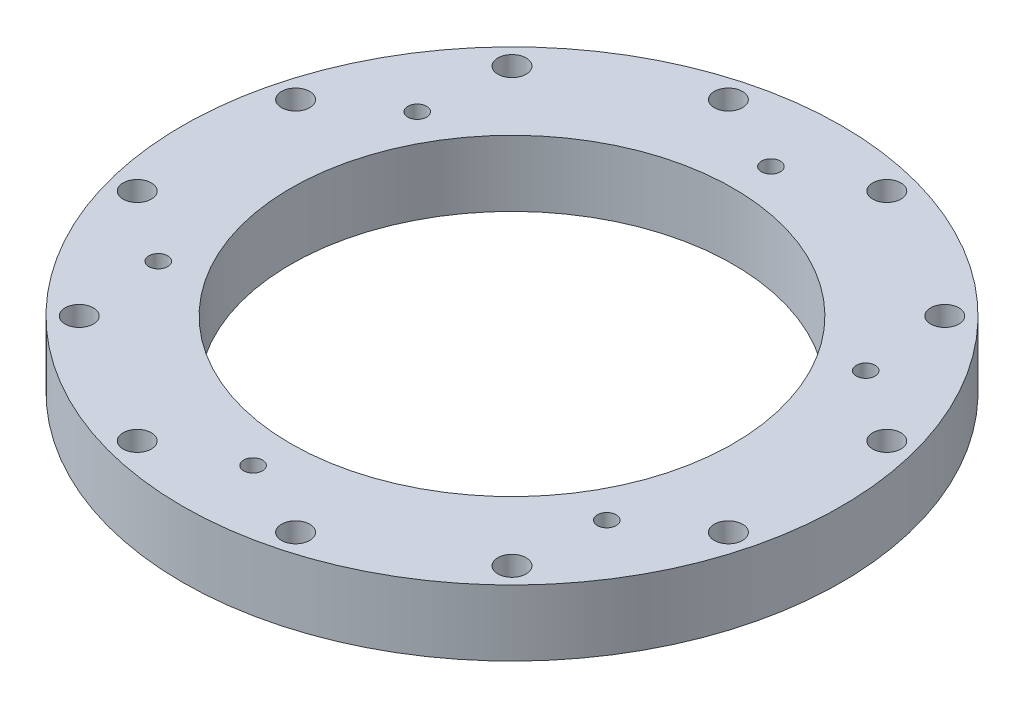
ISO-10303-21;
HEADER;
FILE_DESCRIPTION(('STEP AP214'),'2;1');
FILE_NAME('part.step','',(''),(''),'','','');
FILE_SCHEMA(('AUTOMOTIVE_DESIGN { 1 0 10303 214 1 1 1 1 }'));
ENDSEC;
DATA;
#1=APPLICATION_CONTEXT('core data for automotive mechanical design processes');
#2=APPLICATION_PROTOCOL_DEFINITION('international standard','automotive_design',2000,#1);
#3=PRODUCT_CONTEXT('',#1,'mechanical');
#4=PRODUCT('Part','Part','',(#3));
#5=PRODUCT_RELATED_PRODUCT_CATEGORY('part','',(#4));
#6=PRODUCT_DEFINITION_FORMATION('','',#4);
#7=PRODUCT_DEFINITION_CONTEXT('part definition',#1,'design');
#8=PRODUCT_DEFINITION('design','',#6,#7);
#9=PRODUCT_DEFINITION_SHAPE('','',#8);
#10=(LENGTH_UNIT() NAMED_UNIT(*) SI_UNIT(.MILLI.,.METRE.));
#11=(NAMED_UNIT(*) PLANE_ANGLE_UNIT() SI_UNIT($,.RADIAN.));
#12=(NAMED_UNIT(*) SI_UNIT($,.STERADIAN.) SOLID_ANGLE_UNIT());
#13=UNCERTAINTY_MEASURE_WITH_UNIT(LENGTH_MEASURE(1.E-05),#10,'distance_accuracy_value','');
#14=(GEOMETRIC_REPRESENTATION_CONTEXT(3) GLOBAL_UNCERTAINTY_ASSIGNED_CONTEXT((#13)) GLOBAL_UNIT_ASSIGNED_CONTEXT((#10,
#11,#12)) REPRESENTATION_CONTEXT('',''));
#15=CARTESIAN_POINT('',(0.,0.,0.));
#16=DIRECTION('',(0.,0.,1.));
#17=DIRECTION('',(1.,0.,0.));
#18=AXIS2_PLACEMENT_3D('',#15,#16,#17);
#19=CARTESIAN_POINT('',(0.,7.,0.));
#20=DIRECTION('',(0.,1.,0.));
#21=DIRECTION('',(0.,0.,1.));
#22=AXIS2_PLACEMENT_3D('',#19,#20,#21);
#23=PLANE('',#22);
#24=CARTESIAN_POINT('',(-8.4116189658321,7.,31.3925893543947));
#25=DIRECTION('',(0.,1.,0.));
#26=DIRECTION('',(0.,0.,1.));
#27=AXIS2_PLACEMENT_3D('',#24,#25,#26);
#28=CIRCLE('',#27,1.5);
#29=CARTESIAN_POINT('',(-8.4116189658321,7.,32.8925893543947));
#30=VERTEX_POINT('',#29);
#31=EDGE_CURVE('E143',#30,#30,#28,.T.);
#32=ORIENTED_EDGE('',*,*,#31,.F.);
#33=EDGE_LOOP('',(#32));
#34=FACE_BOUND('',#33,.T.);
#35=CARTESIAN_POINT('',(22.9809703885627,7.,22.9809703885629));
#36=DIRECTION('',(0.,1.,0.));
#37=DIRECTION('',(0.,0.,1.));
#38=AXIS2_PLACEMENT_3D('',#35,#36,#37);
#39=CIRCLE('',#38,1.5);
#40=CARTESIAN_POINT('',(22.9809703885627,7.,24.4809703885629));
#41=VERTEX_POINT('',#40);
#42=EDGE_CURVE('E131',#41,#41,#39,.T.);
#43=ORIENTED_EDGE('',*,*,#42,.F.);
#44=EDGE_LOOP('',(#43));
#45=FACE_BOUND('',#44,.T.);
#46=CARTESIAN_POINT('',(31.3925893543948,7.,-8.41161896583173));
#47=DIRECTION('',(0.,1.,0.));
#48=DIRECTION('',(0.,0.,1.));
#49=AXIS2_PLACEMENT_3D('',#46,#47,#48);
#50=CIRCLE('',#49,1.5);
#51=CARTESIAN_POINT('',(31.3925893543948,7.,-6.91161896583172));
#52=VERTEX_POINT('',#51);
#53=EDGE_CURVE('E119',#52,#52,#50,.T.);
#54=ORIENTED_EDGE('',*,*,#53,.F.);
#55=EDGE_LOOP('',(#54));
#56=FACE_BOUND('',#55,.T.);
#57=CARTESIAN_POINT('',(8.41161896583212,7.,-31.3925893543947));
#58=DIRECTION('',(0.,1.,0.));
#59=DIRECTION('',(0.,0.,1.));
#60=AXIS2_PLACEMENT_3D('',#57,#58,#59);
#61=CIRCLE('',#60,1.5);
#62=CARTESIAN_POINT('',(8.41161896583212,7.,-29.8925893543947));
#63=VERTEX_POINT('',#62);
#64=EDGE_CURVE('E107',#63,#63,#61,.T.);
#65=ORIENTED_EDGE('',*,*,#64,.F.);
#66=EDGE_LOOP('',(#65));
#67=FACE_BOUND('',#66,.T.);
#68=CARTESIAN_POINT('',(-22.9809703885626,7.,-22.9809703885629));
#69=DIRECTION('',(0.,1.,0.));
#70=DIRECTION('',(0.,0.,1.));
#71=AXIS2_PLACEMENT_3D('',#68,#69,#70);
#72=CIRCLE('',#71,1.5);
#73=CARTESIAN_POINT('',(-22.9809703885626,7.,-21.4809703885629));
#74=VERTEX_POINT('',#73);
#75=EDGE_CURVE('E95',#74,#74,#72,.T.);
#76=ORIENTED_EDGE('',*,*,#75,.F.);
#77=EDGE_LOOP('',(#76));
#78=FACE_BOUND('',#77,.T.);
#79=CARTESIAN_POINT('',(-31.3925893543948,7.,8.41161896583172));
#80=DIRECTION('',(0.,1.,0.));
#81=DIRECTION('',(0.,0.,1.));
#82=AXIS2_PLACEMENT_3D('',#79,#80,#81);
#83=CIRCLE('',#82,1.5);
#84=CARTESIAN_POINT('',(-31.3925893543948,7.,9.91161896583173));
#85=VERTEX_POINT('',#84);
#86=EDGE_CURVE('E83',#85,#85,#83,.T.);
#87=ORIENTED_EDGE('',*,*,#86,.F.);
#88=EDGE_LOOP('',(#87));
#89=FACE_BOUND('',#88,.T.);
#90=CARTESIAN_POINT('',(-23.8156986040701,7.,13.7500000000011));
#91=DIRECTION('',(0.,1.,0.));
#92=DIRECTION('',(0.,0.,1.));
#93=AXIS2_PLACEMENT_3D('',#90,#91,#92);
#94=CIRCLE('',#93,1.);
#95=CARTESIAN_POINT('',(-23.8156986040701,7.,14.7500000000011));
#96=VERTEX_POINT('',#95);
#97=EDGE_CURVE('E71',#96,#96,#94,.T.);
#98=ORIENTED_EDGE('',*,*,#97,.F.);
#99=EDGE_LOOP('',(#98));
#100=FACE_BOUND('',#99,.T.);
#101=CARTESIAN_POINT('',(23.815698604074,7.,13.7499999999989));
#102=DIRECTION('',(0.,1.,0.));
#103=DIRECTION('',(0.,0.,1.));
#104=AXIS2_PLACEMENT_3D('',#101,#102,#103);
#105=CIRCLE('',#104,1.);
#106=CARTESIAN_POINT('',(23.815698604074,7.,14.7499999999989));
#107=VERTEX_POINT('',#106);
#108=EDGE_CURVE('E59',#107,#107,#105,.T.);
#109=ORIENTED_EDGE('',*,*,#108,.F.);
#110=EDGE_LOOP('',(#109));
#111=FACE_BOUND('',#110,.T.);
#112=CARTESIAN_POINT('',(0.,7.,-27.5));
#113=DIRECTION('',(0.,1.,0.));
#114=DIRECTION('',(0.,0.,1.));
#115=AXIS2_PLACEMENT_3D('',#112,#113,#114);
#116=CIRCLE('',#115,1.);
#117=CARTESIAN_POINT('',(0.,7.,-26.5));
#118=VERTEX_POINT('',#117);
#119=EDGE_CURVE('E47',#118,#118,#116,.T.);
#120=ORIENTED_EDGE('',*,*,#119,.F.);
#121=EDGE_LOOP('',(#120));
#122=FACE_BOUND('',#121,.T.);
#123=CARTESIAN_POINT('',(0.,7.,0.));
#124=DIRECTION('',(0.,1.,0.));
#125=DIRECTION('',(0.,0.,1.));
#126=AXIS2_PLACEMENT_3D('',#123,#124,#125);
#127=CIRCLE('',#126,35.);
#128=CARTESIAN_POINT('',(0.,7.,35.));
#129=VERTEX_POINT('',#128);
#130=EDGE_CURVE('E10',#129,#129,#127,.T.);
#131=ORIENTED_EDGE('',*,*,#130,.T.);
#132=EDGE_LOOP('',(#131));
#133=FACE_BOUND('',#132,.T.);
#134=CARTESIAN_POINT('',(0.,7.,0.));
#135=DIRECTION('',(0.,1.,0.));
#136=DIRECTION('',(0.,0.,1.));
#137=AXIS2_PLACEMENT_3D('',#134,#135,#136);
#138=CIRCLE('',#137,23.5);
#139=CARTESIAN_POINT('',(0.,7.,23.5));
#140=VERTEX_POINT('',#139);
#141=EDGE_CURVE('E42',#140,#140,#138,.T.);
#142=ORIENTED_EDGE('',*,*,#141,.F.);
#143=EDGE_LOOP('',(#142));
#144=FACE_BOUND('',#143,.T.);
#145=CARTESIAN_POINT('',(23.8156986040727,7.,-13.7500000000011));
#146=DIRECTION('',(0.,1.,0.));
#147=DIRECTION('',(0.,0.,1.));
#148=AXIS2_PLACEMENT_3D('',#145,#146,#147);
#149=CIRCLE('',#148,1.);
#150=CARTESIAN_POINT('',(23.8156986040727,7.,-12.7500000000011));
#151=VERTEX_POINT('',#150);
#152=EDGE_CURVE('E53',#151,#151,#149,.T.);
#153=ORIENTED_EDGE('',*,*,#152,.F.);
#154=EDGE_LOOP('',(#153));
#155=FACE_BOUND('',#154,.T.);
#156=CARTESIAN_POINT('',(2.54662586584425E-12,7.,27.5));
#157=DIRECTION('',(0.,1.,0.));
#158=DIRECTION('',(0.,0.,1.));
#159=AXIS2_PLACEMENT_3D('',#156,#157,#158);
#160=CIRCLE('',#159,1.);
#161=CARTESIAN_POINT('',(2.54662586584425E-12,7.,28.5));
#162=VERTEX_POINT('',#161);
#163=EDGE_CURVE('E65',#162,#162,#160,.T.);
#164=ORIENTED_EDGE('',*,*,#163,.F.);
#165=EDGE_LOOP('',(#164));
#166=FACE_BOUND('',#165,.T.);
#167=CARTESIAN_POINT('',(-23.8156986040714,7.,-13.7499999999989));
#168=DIRECTION('',(0.,1.,0.));
#169=DIRECTION('',(0.,0.,1.));
#170=AXIS2_PLACEMENT_3D('',#167,#168,#169);
#171=CIRCLE('',#170,1.);
#172=CARTESIAN_POINT('',(-23.8156986040714,7.,-12.7499999999989));
#173=VERTEX_POINT('',#172);
#174=EDGE_CURVE('E77',#173,#173,#171,.T.);
#175=ORIENTED_EDGE('',*,*,#174,.F.);
#176=EDGE_LOOP('',(#175));
#177=FACE_BOUND('',#176,.T.);
#178=CARTESIAN_POINT('',(-31.3925893543947,7.,-8.41161896583212));
#179=DIRECTION('',(0.,1.,0.));
#180=DIRECTION('',(0.,0.,1.));
#181=AXIS2_PLACEMENT_3D('',#178,#179,#180);
#182=CIRCLE('',#181,1.50000000000001);
#183=CARTESIAN_POINT('',(-31.3925893543947,7.,-6.91161896583211));
#184=VERTEX_POINT('',#183);
#185=EDGE_CURVE('E89',#184,#184,#182,.T.);
#186=ORIENTED_EDGE('',*,*,#185,.F.);
#187=EDGE_LOOP('',(#186));
#188=FACE_BOUND('',#187,.T.);
#189=CARTESIAN_POINT('',(-8.41161896583172,7.,-31.3925893543948));
#190=DIRECTION('',(0.,1.,0.));
#191=DIRECTION('',(0.,0.,1.));
#192=AXIS2_PLACEMENT_3D('',#189,#190,#191);
#193=CIRCLE('',#192,1.50000000000001);
#194=CARTESIAN_POINT('',(-8.41161896583172,7.,-29.8925893543948));
#195=VERTEX_POINT('',#194);
#196=EDGE_CURVE('E101',#195,#195,#193,.T.);
#197=ORIENTED_EDGE('',*,*,#196,.F.);
#198=EDGE_LOOP('',(#197));
#199=FACE_BOUND('',#198,.T.);
#200=CARTESIAN_POINT('',(22.9809703885629,7.,-22.9809703885627));
#201=DIRECTION('',(0.,1.,0.));
#202=DIRECTION('',(0.,0.,1.));
#203=AXIS2_PLACEMENT_3D('',#200,#201,#202);
#204=CIRCLE('',#203,1.5);
#205=CARTESIAN_POINT('',(22.9809703885629,7.,-21.4809703885627));
#206=VERTEX_POINT('',#205);
#207=EDGE_CURVE('E113',#206,#206,#204,.T.);
#208=ORIENTED_EDGE('',*,*,#207,.F.);
#209=EDGE_LOOP('',(#208));
#210=FACE_BOUND('',#209,.T.);
#211=CARTESIAN_POINT('',(31.3925893543947,7.,8.41161896583211));
#212=DIRECTION('',(0.,1.,0.));
#213=DIRECTION('',(0.,0.,1.));
#214=AXIS2_PLACEMENT_3D('',#211,#212,#213);
#215=CIRCLE('',#214,1.50000000000001);
#216=CARTESIAN_POINT('',(31.3925893543947,7.,9.91161896583212));
#217=VERTEX_POINT('',#216);
#218=EDGE_CURVE('E125',#217,#217,#215,.T.);
#219=ORIENTED_EDGE('',*,*,#218,.F.);
#220=EDGE_LOOP('',(#219));
#221=FACE_BOUND('',#220,.T.);
#222=CARTESIAN_POINT('',(8.41161896583173,7.,31.3925893543948));
#223=DIRECTION('',(0.,1.,0.));
#224=DIRECTION('',(0.,0.,1.));
#225=AXIS2_PLACEMENT_3D('',#222,#223,#224);
#226=CIRCLE('',#225,1.50000000000001);
#227=CARTESIAN_POINT('',(8.41161896583173,7.,32.8925893543948));
#228=VERTEX_POINT('',#227);
#229=EDGE_CURVE('E137',#228,#228,#226,.T.);
#230=ORIENTED_EDGE('',*,*,#229,.F.);
#231=EDGE_LOOP('',(#230));
#232=FACE_BOUND('',#231,.T.);
#233=CARTESIAN_POINT('',(-22.9809703885629,7.,22.9809703885627));
#234=DIRECTION('',(0.,1.,0.));
#235=DIRECTION('',(0.,0.,1.));
#236=AXIS2_PLACEMENT_3D('',#233,#234,#235);
#237=CIRCLE('',#236,1.50000000000001);
#238=CARTESIAN_POINT('',(-22.9809703885629,7.,24.4809703885627));
#239=VERTEX_POINT('',#238);
#240=EDGE_CURVE('E149',#239,#239,#237,.T.);
#241=ORIENTED_EDGE('',*,*,#240,.F.);
#242=EDGE_LOOP('',(#241));
#243=FACE_BOUND('',#242,.T.);
#244=ADVANCED_FACE('F31',(#34,#45,#56,#67,#78,#89,#100,#111,#122,#133,#144,#155,#166,#177,#188,
#199,#210,#221,#232,#243),#23,.T.);
#245=CARTESIAN_POINT('',(0.,0.,0.));
#246=DIRECTION('',(0.,1.,0.));
#247=DIRECTION('',(0.,0.,1.));
#248=AXIS2_PLACEMENT_3D('',#245,#246,#247);
#249=PLANE('',#248);
#250=CARTESIAN_POINT('',(0.,0.,0.));
#251=DIRECTION('',(0.,1.,0.));
#252=DIRECTION('',(0.,0.,1.));
#253=AXIS2_PLACEMENT_3D('',#250,#251,#252);
#254=CIRCLE('',#253,35.);
#255=CARTESIAN_POINT('',(0.,0.,35.));
#256=VERTEX_POINT('',#255);
#257=EDGE_CURVE('E35',#256,#256,#254,.T.);
#258=ORIENTED_EDGE('',*,*,#257,.F.);
#259=EDGE_LOOP('',(#258));
#260=FACE_BOUND('',#259,.T.);
#261=CARTESIAN_POINT('',(0.,0.,0.));
#262=DIRECTION('',(0.,1.,0.));
#263=DIRECTION('',(0.,0.,1.));
#264=AXIS2_PLACEMENT_3D('',#261,#262,#263);
#265=CIRCLE('',#264,23.5);
#266=CARTESIAN_POINT('',(0.,0.,23.5));
#267=VERTEX_POINT('',#266);
#268=EDGE_CURVE('E44',#267,#267,#265,.T.);
#269=ORIENTED_EDGE('',*,*,#268,.T.);
#270=EDGE_LOOP('',(#269));
#271=FACE_BOUND('',#270,.T.);
#272=CARTESIAN_POINT('',(0.,0.,-27.5));
#273=DIRECTION('',(0.,1.,0.));
#274=DIRECTION('',(0.,0.,1.));
#275=AXIS2_PLACEMENT_3D('',#272,#273,#274);
#276=CIRCLE('',#275,1.);
#277=CARTESIAN_POINT('',(0.,0.,-26.5));
#278=VERTEX_POINT('',#277);
#279=EDGE_CURVE('E50',#278,#278,#276,.T.);
#280=ORIENTED_EDGE('',*,*,#279,.T.);
#281=EDGE_LOOP('',(#280));
#282=FACE_BOUND('',#281,.T.);
#283=CARTESIAN_POINT('',(23.8156986040727,0.,-13.7500000000011));
#284=DIRECTION('',(0.,1.,0.));
#285=DIRECTION('',(0.,0.,1.));
#286=AXIS2_PLACEMENT_3D('',#283,#284,#285);
#287=CIRCLE('',#286,1.);
#288=CARTESIAN_POINT('',(23.8156986040727,0.,-12.7500000000011));
#289=VERTEX_POINT('',#288);
#290=EDGE_CURVE('E56',#289,#289,#287,.T.);
#291=ORIENTED_EDGE('',*,*,#290,.T.);
#292=EDGE_LOOP('',(#291));
#293=FACE_BOUND('',#292,.T.);
#294=CARTESIAN_POINT('',(23.815698604074,0.,13.7499999999989));
#295=DIRECTION('',(0.,1.,0.));
#296=DIRECTION('',(0.,0.,1.));
#297=AXIS2_PLACEMENT_3D('',#294,#295,#296);
#298=CIRCLE('',#297,1.);
#299=CARTESIAN_POINT('',(23.815698604074,0.,14.7499999999989));
#300=VERTEX_POINT('',#299);
#301=EDGE_CURVE('E62',#300,#300,#298,.T.);
#302=ORIENTED_EDGE('',*,*,#301,.T.);
#303=EDGE_LOOP('',(#302));
#304=FACE_BOUND('',#303,.T.);
#305=CARTESIAN_POINT('',(2.54662586584425E-12,0.,27.5));
#306=DIRECTION('',(0.,1.,0.));
#307=DIRECTION('',(0.,0.,1.));
#308=AXIS2_PLACEMENT_3D('',#305,#306,#307);
#309=CIRCLE('',#308,1.);
#310=CARTESIAN_POINT('',(2.54662586584425E-12,0.,28.5));
#311=VERTEX_POINT('',#310);
#312=EDGE_CURVE('E68',#311,#311,#309,.T.);
#313=ORIENTED_EDGE('',*,*,#312,.T.);
#314=EDGE_LOOP('',(#313));
#315=FACE_BOUND('',#314,.T.);
#316=CARTESIAN_POINT('',(-23.8156986040701,0.,13.7500000000011));
#317=DIRECTION('',(0.,1.,0.));
#318=DIRECTION('',(0.,0.,1.));
#319=AXIS2_PLACEMENT_3D('',#316,#317,#318);
#320=CIRCLE('',#319,1.);
#321=CARTESIAN_POINT('',(-23.8156986040701,0.,14.7500000000011));
#322=VERTEX_POINT('',#321);
#323=EDGE_CURVE('E74',#322,#322,#320,.T.);
#324=ORIENTED_EDGE('',*,*,#323,.T.);
#325=EDGE_LOOP('',(#324));
#326=FACE_BOUND('',#325,.T.);
#327=CARTESIAN_POINT('',(-23.8156986040714,0.,-13.7499999999989));
#328=DIRECTION('',(0.,1.,0.));
#329=DIRECTION('',(0.,0.,1.));
#330=AXIS2_PLACEMENT_3D('',#327,#328,#329);
#331=CIRCLE('',#330,1.);
#332=CARTESIAN_POINT('',(-23.8156986040714,0.,-12.7499999999989));
#333=VERTEX_POINT('',#332);
#334=EDGE_CURVE('E80',#333,#333,#331,.T.);
#335=ORIENTED_EDGE('',*,*,#334,.T.);
#336=EDGE_LOOP('',(#335));
#337=FACE_BOUND('',#336,.T.);
#338=CARTESIAN_POINT('',(-31.3925893543948,0.,8.41161896583172));
#339=DIRECTION('',(0.,1.,0.));
#340=DIRECTION('',(0.,0.,1.));
#341=AXIS2_PLACEMENT_3D('',#338,#339,#340);
#342=CIRCLE('',#341,1.5);
#343=CARTESIAN_POINT('',(-31.3925893543948,0.,9.91161896583173));
#344=VERTEX_POINT('',#343);
#345=EDGE_CURVE('E86',#344,#344,#342,.T.);
#346=ORIENTED_EDGE('',*,*,#345,.T.);
#347=EDGE_LOOP('',(#346));
#348=FACE_BOUND('',#347,.T.);
#349=CARTESIAN_POINT('',(-31.3925893543947,0.,-8.41161896583212));
#350=DIRECTION('',(0.,1.,0.));
#351=DIRECTION('',(0.,0.,1.));
#352=AXIS2_PLACEMENT_3D('',#349,#350,#351);
#353=CIRCLE('',#352,1.50000000000001);
#354=CARTESIAN_POINT('',(-31.3925893543947,0.,-6.91161896583211));
#355=VERTEX_POINT('',#354);
#356=EDGE_CURVE('E92',#355,#355,#353,.T.);
#357=ORIENTED_EDGE('',*,*,#356,.T.);
#358=EDGE_LOOP('',(#357));
#359=FACE_BOUND('',#358,.T.);
#360=CARTESIAN_POINT('',(-22.9809703885626,0.,-22.9809703885629));
#361=DIRECTION('',(0.,1.,0.));
#362=DIRECTION('',(0.,0.,1.));
#363=AXIS2_PLACEMENT_3D('',#360,#361,#362);
#364=CIRCLE('',#363,1.5);
#365=CARTESIAN_POINT('',(-22.9809703885626,0.,-21.4809703885629));
#366=VERTEX_POINT('',#365);
#367=EDGE_CURVE('E98',#366,#366,#364,.T.);
#368=ORIENTED_EDGE('',*,*,#367,.T.);
#369=EDGE_LOOP('',(#368));
#370=FACE_BOUND('',#369,.T.);
#371=CARTESIAN_POINT('',(-8.41161896583172,0.,-31.3925893543948));
#372=DIRECTION('',(0.,1.,0.));
#373=DIRECTION('',(0.,0.,1.));
#374=AXIS2_PLACEMENT_3D('',#371,#372,#373);
#375=CIRCLE('',#374,1.50000000000001);
#376=CARTESIAN_POINT('',(-8.41161896583172,0.,-29.8925893543948));
#377=VERTEX_POINT('',#376);
#378=EDGE_CURVE('E104',#377,#377,#375,.T.);
#379=ORIENTED_EDGE('',*,*,#378,.T.);
#380=EDGE_LOOP('',(#379));
#381=FACE_BOUND('',#380,.T.);
#382=CARTESIAN_POINT('',(8.41161896583212,0.,-31.3925893543947));
#383=DIRECTION('',(0.,1.,0.));
#384=DIRECTION('',(0.,0.,1.));
#385=AXIS2_PLACEMENT_3D('',#382,#383,#384);
#386=CIRCLE('',#385,1.5);
#387=CARTESIAN_POINT('',(8.41161896583212,0.,-29.8925893543947));
#388=VERTEX_POINT('',#387);
#389=EDGE_CURVE('E110',#388,#388,#386,.T.);
#390=ORIENTED_EDGE('',*,*,#389,.T.);
#391=EDGE_LOOP('',(#390));
#392=FACE_BOUND('',#391,.T.);
#393=CARTESIAN_POINT('',(22.9809703885629,0.,-22.9809703885627));
#394=DIRECTION('',(0.,1.,0.));
#395=DIRECTION('',(0.,0.,1.));
#396=AXIS2_PLACEMENT_3D('',#393,#394,#395);
#397=CIRCLE('',#396,1.5);
#398=CARTESIAN_POINT('',(22.9809703885629,0.,-21.4809703885627));
#399=VERTEX_POINT('',#398);
#400=EDGE_CURVE('E116',#399,#399,#397,.T.);
#401=ORIENTED_EDGE('',*,*,#400,.T.);
#402=EDGE_LOOP('',(#401));
#403=FACE_BOUND('',#402,.T.);
#404=CARTESIAN_POINT('',(31.3925893543948,0.,-8.41161896583173));
#405=DIRECTION('',(0.,1.,0.));
#406=DIRECTION('',(0.,0.,1.));
#407=AXIS2_PLACEMENT_3D('',#404,#405,#406);
#408=CIRCLE('',#407,1.5);
#409=CARTESIAN_POINT('',(31.3925893543948,0.,-6.91161896583172));
#410=VERTEX_POINT('',#409);
#411=EDGE_CURVE('E122',#410,#410,#408,.T.);
#412=ORIENTED_EDGE('',*,*,#411,.T.);
#413=EDGE_LOOP('',(#412));
#414=FACE_BOUND('',#413,.T.);
#415=CARTESIAN_POINT('',(31.3925893543947,0.,8.41161896583211));
#416=DIRECTION('',(0.,1.,0.));
#417=DIRECTION('',(0.,0.,1.));
#418=AXIS2_PLACEMENT_3D('',#415,#416,#417);
#419=CIRCLE('',#418,1.50000000000001);
#420=CARTESIAN_POINT('',(31.3925893543947,0.,9.91161896583212));
#421=VERTEX_POINT('',#420);
#422=EDGE_CURVE('E128',#421,#421,#419,.T.);
#423=ORIENTED_EDGE('',*,*,#422,.T.);
#424=EDGE_LOOP('',(#423));
#425=FACE_BOUND('',#424,.T.);
#426=CARTESIAN_POINT('',(22.9809703885627,0.,22.9809703885629));
#427=DIRECTION('',(0.,1.,0.));
#428=DIRECTION('',(0.,0.,1.));
#429=AXIS2_PLACEMENT_3D('',#426,#427,#428);
#430=CIRCLE('',#429,1.5);
#431=CARTESIAN_POINT('',(22.9809703885627,0.,24.4809703885629));
#432=VERTEX_POINT('',#431);
#433=EDGE_CURVE('E134',#432,#432,#430,.T.);
#434=ORIENTED_EDGE('',*,*,#433,.T.);
#435=EDGE_LOOP('',(#434));
#436=FACE_BOUND('',#435,.T.);
#437=CARTESIAN_POINT('',(8.41161896583173,0.,31.3925893543948));
#438=DIRECTION('',(0.,1.,0.));
#439=DIRECTION('',(0.,0.,1.));
#440=AXIS2_PLACEMENT_3D('',#437,#438,#439);
#441=CIRCLE('',#440,1.50000000000001);
#442=CARTESIAN_POINT('',(8.41161896583173,0.,32.8925893543948));
#443=VERTEX_POINT('',#442);
#444=EDGE_CURVE('E140',#443,#443,#441,.T.);
#445=ORIENTED_EDGE('',*,*,#444,.T.);
#446=EDGE_LOOP('',(#445));
#447=FACE_BOUND('',#446,.T.);
#448=CARTESIAN_POINT('',(-8.4116189658321,0.,31.3925893543947));
#449=DIRECTION('',(0.,1.,0.));
#450=DIRECTION('',(0.,0.,1.));
#451=AXIS2_PLACEMENT_3D('',#448,#449,#450);
#452=CIRCLE('',#451,1.5);
#453=CARTESIAN_POINT('',(-8.4116189658321,0.,32.8925893543947));
#454=VERTEX_POINT('',#453);
#455=EDGE_CURVE('E146',#454,#454,#452,.T.);
#456=ORIENTED_EDGE('',*,*,#455,.T.);
#457=EDGE_LOOP('',(#456));
#458=FACE_BOUND('',#457,.T.);
#459=CARTESIAN_POINT('',(-22.9809703885629,0.,22.9809703885627));
#460=DIRECTION('',(0.,1.,0.));
#461=DIRECTION('',(0.,0.,1.));
#462=AXIS2_PLACEMENT_3D('',#459,#460,#461);
#463=CIRCLE('',#462,1.50000000000001);
#464=CARTESIAN_POINT('',(-22.9809703885629,0.,24.4809703885627));
#465=VERTEX_POINT('',#464);
#466=EDGE_CURVE('E152',#465,#465,#463,.T.);
#467=ORIENTED_EDGE('',*,*,#466,.T.);
#468=EDGE_LOOP('',(#467));
#469=FACE_BOUND('',#468,.T.);
#470=ADVANCED_FACE('F162',(#260,#271,#282,#293,#304,#315,#326,#337,#348,#359,#370,#381,#392,
#403,#414,#425,#436,#447,#458,#469),#249,.F.);
#471=CARTESIAN_POINT('',(0.,7.,0.));
#472=DIRECTION('',(0.,-1.,0.));
#473=DIRECTION('',(0.,0.,-1.));
#474=AXIS2_PLACEMENT_3D('',#471,#472,#473);
#475=CYLINDRICAL_SURFACE('',#474,35.);
#476=ORIENTED_EDGE('',*,*,#130,.F.);
#477=EDGE_LOOP('',(#476));
#478=FACE_BOUND('',#477,.T.);
#479=ORIENTED_EDGE('',*,*,#257,.T.);
#480=EDGE_LOOP('',(#479));
#481=FACE_BOUND('',#480,.T.);
#482=ADVANCED_FACE('F33',(#478,#481),#475,.T.);
#483=CARTESIAN_POINT('',(0.,7.,0.));
#484=DIRECTION('',(0.,-1.,0.));
#485=DIRECTION('',(0.,0.,-1.));
#486=AXIS2_PLACEMENT_3D('',#483,#484,#485);
#487=CYLINDRICAL_SURFACE('',#486,23.5);
#488=ORIENTED_EDGE('',*,*,#141,.T.);
#489=EDGE_LOOP('',(#488));
#490=FACE_BOUND('',#489,.T.);
#491=ORIENTED_EDGE('',*,*,#268,.F.);
#492=EDGE_LOOP('',(#491));
#493=FACE_BOUND('',#492,.T.);
#494=ADVANCED_FACE('F172',(#490,#493),#487,.F.);
#495=CARTESIAN_POINT('',(0.,7.,-27.5));
#496=DIRECTION('',(0.,-1.,0.));
#497=DIRECTION('',(0.,0.,-1.));
#498=AXIS2_PLACEMENT_3D('',#495,#496,#497);
#499=CYLINDRICAL_SURFACE('',#498,1.);
#500=ORIENTED_EDGE('',*,*,#119,.T.);
#501=EDGE_LOOP('',(#500));
#502=FACE_BOUND('',#501,.T.);
#503=ORIENTED_EDGE('',*,*,#279,.F.);
#504=EDGE_LOOP('',(#503));
#505=FACE_BOUND('',#504,.T.);
#506=ADVANCED_FACE('F175',(#502,#505),#499,.F.);
#507=CARTESIAN_POINT('',(23.8156986040727,7.,-13.7500000000011));
#508=DIRECTION('',(0.,-1.,0.));
#509=DIRECTION('',(0.,0.,-1.));
#510=AXIS2_PLACEMENT_3D('',#507,#508,#509);
#511=CYLINDRICAL_SURFACE('',#510,1.);
#512=ORIENTED_EDGE('',*,*,#152,.T.);
#513=EDGE_LOOP('',(#512));
#514=FACE_BOUND('',#513,.T.);
#515=ORIENTED_EDGE('',*,*,#290,.F.);
#516=EDGE_LOOP('',(#515));
#517=FACE_BOUND('',#516,.T.);
#518=ADVANCED_FACE('F179',(#514,#517),#511,.F.);
#519=CARTESIAN_POINT('',(23.815698604074,7.,13.7499999999989));
#520=DIRECTION('',(0.,-1.,0.));
#521=DIRECTION('',(0.,0.,-1.));
#522=AXIS2_PLACEMENT_3D('',#519,#520,#521);
#523=CYLINDRICAL_SURFACE('',#522,1.);
#524=ORIENTED_EDGE('',*,*,#108,.T.);
#525=EDGE_LOOP('',(#524));
#526=FACE_BOUND('',#525,.T.);
#527=ORIENTED_EDGE('',*,*,#301,.F.);
#528=EDGE_LOOP('',(#527));
#529=FACE_BOUND('',#528,.T.);
#530=ADVANCED_FACE('F183',(#526,#529),#523,.F.);
#531=CARTESIAN_POINT('',(2.54662586584425E-12,7.,27.5));
#532=DIRECTION('',(0.,-1.,0.));
#533=DIRECTION('',(0.,0.,-1.));
#534=AXIS2_PLACEMENT_3D('',#531,#532,#533);
#535=CYLINDRICAL_SURFACE('',#534,1.);
#536=ORIENTED_EDGE('',*,*,#163,.T.);
#537=EDGE_LOOP('',(#536));
#538=FACE_BOUND('',#537,.T.);
#539=ORIENTED_EDGE('',*,*,#312,.F.);
#540=EDGE_LOOP('',(#539));
#541=FACE_BOUND('',#540,.T.);
#542=ADVANCED_FACE('F187',(#538,#541),#535,.F.);
#543=CARTESIAN_POINT('',(-23.8156986040701,7.,13.7500000000011));
#544=DIRECTION('',(0.,-1.,0.));
#545=DIRECTION('',(0.,0.,-1.));
#546=AXIS2_PLACEMENT_3D('',#543,#544,#545);
#547=CYLINDRICAL_SURFACE('',#546,1.);
#548=ORIENTED_EDGE('',*,*,#97,.T.);
#549=EDGE_LOOP('',(#548));
#550=FACE_BOUND('',#549,.T.);
#551=ORIENTED_EDGE('',*,*,#323,.F.);
#552=EDGE_LOOP('',(#551));
#553=FACE_BOUND('',#552,.T.);
#554=ADVANCED_FACE('F191',(#550,#553),#547,.F.);
#555=CARTESIAN_POINT('',(-23.8156986040714,7.,-13.7499999999989));
#556=DIRECTION('',(0.,-1.,0.));
#557=DIRECTION('',(0.,0.,-1.));
#558=AXIS2_PLACEMENT_3D('',#555,#556,#557);
#559=CYLINDRICAL_SURFACE('',#558,1.);
#560=ORIENTED_EDGE('',*,*,#174,.T.);
#561=EDGE_LOOP('',(#560));
#562=FACE_BOUND('',#561,.T.);
#563=ORIENTED_EDGE('',*,*,#334,.F.);
#564=EDGE_LOOP('',(#563));
#565=FACE_BOUND('',#564,.T.);
#566=ADVANCED_FACE('F195',(#562,#565),#559,.F.);
#567=CARTESIAN_POINT('',(-31.3925893543948,7.,8.41161896583172));
#568=DIRECTION('',(0.,-1.,0.));
#569=DIRECTION('',(0.,0.,-1.));
#570=AXIS2_PLACEMENT_3D('',#567,#568,#569);
#571=CYLINDRICAL_SURFACE('',#570,1.5);
#572=ORIENTED_EDGE('',*,*,#86,.T.);
#573=EDGE_LOOP('',(#572));
#574=FACE_BOUND('',#573,.T.);
#575=ORIENTED_EDGE('',*,*,#345,.F.);
#576=EDGE_LOOP('',(#575));
#577=FACE_BOUND('',#576,.T.);
#578=ADVANCED_FACE('F199',(#574,#577),#571,.F.);
#579=CARTESIAN_POINT('',(-31.3925893543947,7.,-8.41161896583212));
#580=DIRECTION('',(0.,-1.,0.));
#581=DIRECTION('',(0.,0.,-1.));
#582=AXIS2_PLACEMENT_3D('',#579,#580,#581);
#583=CYLINDRICAL_SURFACE('',#582,1.50000000000001);
#584=ORIENTED_EDGE('',*,*,#185,.T.);
#585=EDGE_LOOP('',(#584));
#586=FACE_BOUND('',#585,.T.);
#587=ORIENTED_EDGE('',*,*,#356,.F.);
#588=EDGE_LOOP('',(#587));
#589=FACE_BOUND('',#588,.T.);
#590=ADVANCED_FACE('F203',(#586,#589),#583,.F.);
#591=CARTESIAN_POINT('',(-22.9809703885626,7.,-22.9809703885629));
#592=DIRECTION('',(0.,-1.,0.));
#593=DIRECTION('',(0.,0.,-1.));
#594=AXIS2_PLACEMENT_3D('',#591,#592,#593);
#595=CYLINDRICAL_SURFACE('',#594,1.5);
#596=ORIENTED_EDGE('',*,*,#75,.T.);
#597=EDGE_LOOP('',(#596));
#598=FACE_BOUND('',#597,.T.);
#599=ORIENTED_EDGE('',*,*,#367,.F.);
#600=EDGE_LOOP('',(#599));
#601=FACE_BOUND('',#600,.T.);
#602=ADVANCED_FACE('F207',(#598,#601),#595,.F.);
#603=CARTESIAN_POINT('',(-8.41161896583172,7.,-31.3925893543948));
#604=DIRECTION('',(0.,-1.,0.));
#605=DIRECTION('',(0.,0.,-1.));
#606=AXIS2_PLACEMENT_3D('',#603,#604,#605);
#607=CYLINDRICAL_SURFACE('',#606,1.50000000000001);
#608=ORIENTED_EDGE('',*,*,#196,.T.);
#609=EDGE_LOOP('',(#608));
#610=FACE_BOUND('',#609,.T.);
#611=ORIENTED_EDGE('',*,*,#378,.F.);
#612=EDGE_LOOP('',(#611));
#613=FACE_BOUND('',#612,.T.);
#614=ADVANCED_FACE('F211',(#610,#613),#607,.F.);
#615=CARTESIAN_POINT('',(8.41161896583212,7.,-31.3925893543947));
#616=DIRECTION('',(0.,-1.,0.));
#617=DIRECTION('',(0.,0.,-1.));
#618=AXIS2_PLACEMENT_3D('',#615,#616,#617);
#619=CYLINDRICAL_SURFACE('',#618,1.5);
#620=ORIENTED_EDGE('',*,*,#64,.T.);
#621=EDGE_LOOP('',(#620));
#622=FACE_BOUND('',#621,.T.);
#623=ORIENTED_EDGE('',*,*,#389,.F.);
#624=EDGE_LOOP('',(#623));
#625=FACE_BOUND('',#624,.T.);
#626=ADVANCED_FACE('F215',(#622,#625),#619,.F.);
#627=CARTESIAN_POINT('',(22.9809703885629,7.,-22.9809703885627));
#628=DIRECTION('',(0.,-1.,0.));
#629=DIRECTION('',(0.,0.,-1.));
#630=AXIS2_PLACEMENT_3D('',#627,#628,#629);
#631=CYLINDRICAL_SURFACE('',#630,1.5);
#632=ORIENTED_EDGE('',*,*,#207,.T.);
#633=EDGE_LOOP('',(#632));
#634=FACE_BOUND('',#633,.T.);
#635=ORIENTED_EDGE('',*,*,#400,.F.);
#636=EDGE_LOOP('',(#635));
#637=FACE_BOUND('',#636,.T.);
#638=ADVANCED_FACE('F219',(#634,#637),#631,.F.);
#639=CARTESIAN_POINT('',(31.3925893543948,7.,-8.41161896583173));
#640=DIRECTION('',(0.,-1.,0.));
#641=DIRECTION('',(0.,0.,-1.));
#642=AXIS2_PLACEMENT_3D('',#639,#640,#641);
#643=CYLINDRICAL_SURFACE('',#642,1.5);
#644=ORIENTED_EDGE('',*,*,#53,.T.);
#645=EDGE_LOOP('',(#644));
#646=FACE_BOUND('',#645,.T.);
#647=ORIENTED_EDGE('',*,*,#411,.F.);
#648=EDGE_LOOP('',(#647));
#649=FACE_BOUND('',#648,.T.);
#650=ADVANCED_FACE('F223',(#646,#649),#643,.F.);
#651=CARTESIAN_POINT('',(31.3925893543947,7.,8.41161896583211));
#652=DIRECTION('',(0.,-1.,0.));
#653=DIRECTION('',(0.,0.,-1.));
#654=AXIS2_PLACEMENT_3D('',#651,#652,#653);
#655=CYLINDRICAL_SURFACE('',#654,1.50000000000001);
#656=ORIENTED_EDGE('',*,*,#218,.T.);
#657=EDGE_LOOP('',(#656));
#658=FACE_BOUND('',#657,.T.);
#659=ORIENTED_EDGE('',*,*,#422,.F.);
#660=EDGE_LOOP('',(#659));
#661=FACE_BOUND('',#660,.T.);
#662=ADVANCED_FACE('F227',(#658,#661),#655,.F.);
#663=CARTESIAN_POINT('',(22.9809703885627,7.,22.9809703885629));
#664=DIRECTION('',(0.,-1.,0.));
#665=DIRECTION('',(0.,0.,-1.));
#666=AXIS2_PLACEMENT_3D('',#663,#664,#665);
#667=CYLINDRICAL_SURFACE('',#666,1.5);
#668=ORIENTED_EDGE('',*,*,#42,.T.);
#669=EDGE_LOOP('',(#668));
#670=FACE_BOUND('',#669,.T.);
#671=ORIENTED_EDGE('',*,*,#433,.F.);
#672=EDGE_LOOP('',(#671));
#673=FACE_BOUND('',#672,.T.);
#674=ADVANCED_FACE('F231',(#670,#673),#667,.F.);
#675=CARTESIAN_POINT('',(8.41161896583173,7.,31.3925893543948));
#676=DIRECTION('',(0.,-1.,0.));
#677=DIRECTION('',(0.,0.,-1.));
#678=AXIS2_PLACEMENT_3D('',#675,#676,#677);
#679=CYLINDRICAL_SURFACE('',#678,1.50000000000001);
#680=ORIENTED_EDGE('',*,*,#229,.T.);
#681=EDGE_LOOP('',(#680));
#682=FACE_BOUND('',#681,.T.);
#683=ORIENTED_EDGE('',*,*,#444,.F.);
#684=EDGE_LOOP('',(#683));
#685=FACE_BOUND('',#684,.T.);
#686=ADVANCED_FACE('F235',(#682,#685),#679,.F.);
#687=CARTESIAN_POINT('',(-8.4116189658321,7.,31.3925893543947));
#688=DIRECTION('',(0.,-1.,0.));
#689=DIRECTION('',(0.,0.,-1.));
#690=AXIS2_PLACEMENT_3D('',#687,#688,#689);
#691=CYLINDRICAL_SURFACE('',#690,1.5);
#692=ORIENTED_EDGE('',*,*,#31,.T.);
#693=EDGE_LOOP('',(#692));
#694=FACE_BOUND('',#693,.T.);
#695=ORIENTED_EDGE('',*,*,#455,.F.);
#696=EDGE_LOOP('',(#695));
#697=FACE_BOUND('',#696,.T.);
#698=ADVANCED_FACE('F239',(#694,#697),#691,.F.);
#699=CARTESIAN_POINT('',(-22.9809703885629,7.,22.9809703885627));
#700=DIRECTION('',(0.,-1.,0.));
#701=DIRECTION('',(0.,0.,-1.));
#702=AXIS2_PLACEMENT_3D('',#699,#700,#701);
#703=CYLINDRICAL_SURFACE('',#702,1.50000000000001);
#704=ORIENTED_EDGE('',*,*,#240,.T.);
#705=EDGE_LOOP('',(#704));
#706=FACE_BOUND('',#705,.T.);
#707=ORIENTED_EDGE('',*,*,#466,.F.);
#708=EDGE_LOOP('',(#707));
#709=FACE_BOUND('',#708,.T.);
#710=ADVANCED_FACE('F158',(#706,#709),#703,.F.);
#711=CLOSED_SHELL('',(#244,#470,#482,#494,#506,#518,#530,#542,#554,#566,#578,#590,#602,#614,
#626,#638,#650,#662,#674,#686,#698,#710));
#712=MANIFOLD_SOLID_BREP('B2',#711);
#713=ADVANCED_BREP_SHAPE_REPRESENTATION('',(#18,#712),#14);
#714=SHAPE_DEFINITION_REPRESENTATION(#9,#713);
ENDSEC;
END-ISO-10303-21;
